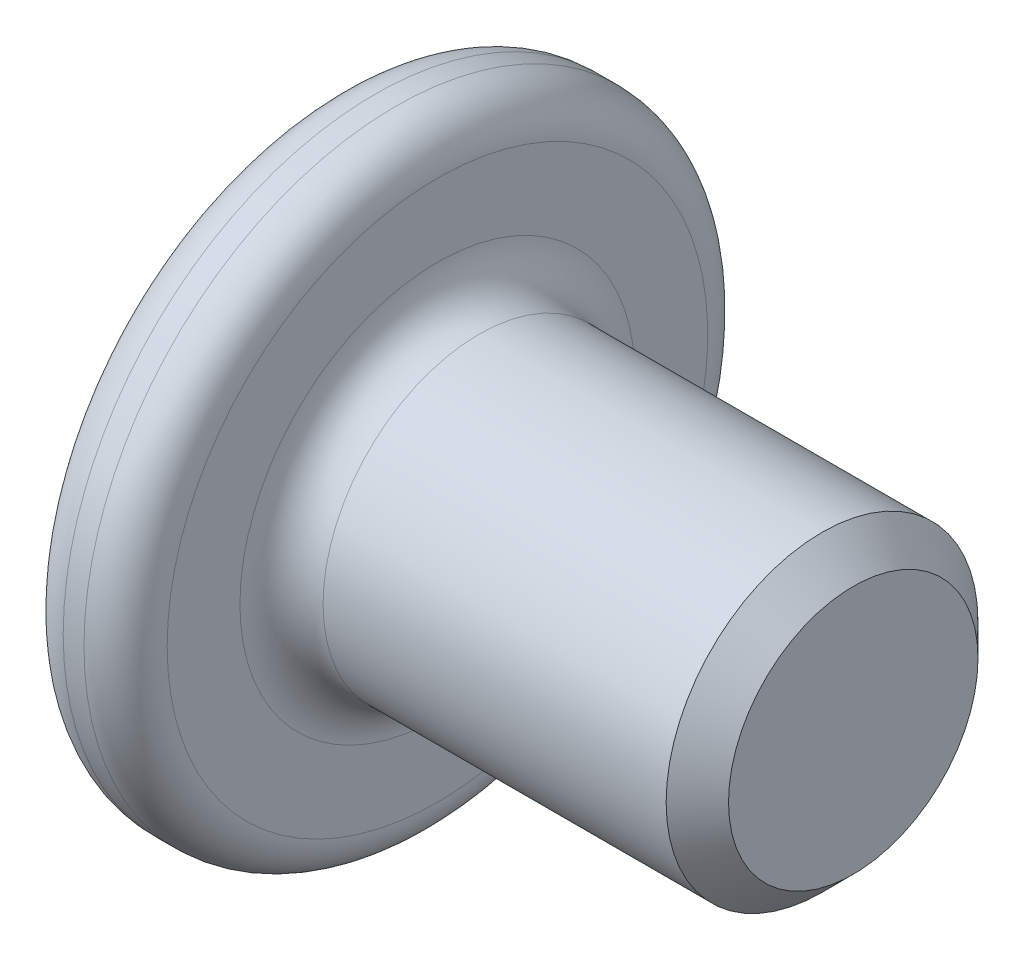
ISO-10303-21;
HEADER;
FILE_DESCRIPTION(('STEP AP214'),'2;1');
FILE_NAME('part.step','',(''),(''),'','','');
FILE_SCHEMA(('AUTOMOTIVE_DESIGN { 1 0 10303 214 1 1 1 1 }'));
ENDSEC;
DATA;
#1=APPLICATION_CONTEXT('core data for automotive mechanical design processes');
#2=APPLICATION_PROTOCOL_DEFINITION('international standard','automotive_design',2000,#1);
#3=PRODUCT_CONTEXT('',#1,'mechanical');
#4=PRODUCT('Part','Part','',(#3));
#5=PRODUCT_RELATED_PRODUCT_CATEGORY('part','',(#4));
#6=PRODUCT_DEFINITION_FORMATION('','',#4);
#7=PRODUCT_DEFINITION_CONTEXT('part definition',#1,'design');
#8=PRODUCT_DEFINITION('design','',#6,#7);
#9=PRODUCT_DEFINITION_SHAPE('','',#8);
#10=(LENGTH_UNIT() NAMED_UNIT(*) SI_UNIT(.MILLI.,.METRE.));
#11=(NAMED_UNIT(*) PLANE_ANGLE_UNIT() SI_UNIT($,.RADIAN.));
#12=(NAMED_UNIT(*) SI_UNIT($,.STERADIAN.) SOLID_ANGLE_UNIT());
#13=UNCERTAINTY_MEASURE_WITH_UNIT(LENGTH_MEASURE(1.E-05),#10,'distance_accuracy_value','');
#14=(GEOMETRIC_REPRESENTATION_CONTEXT(3) GLOBAL_UNCERTAINTY_ASSIGNED_CONTEXT((#13)) GLOBAL_UNIT_ASSIGNED_CONTEXT((#10,
#11,#12)) REPRESENTATION_CONTEXT('',''));
#15=CARTESIAN_POINT('',(0.,0.,0.));
#16=DIRECTION('',(0.,0.,1.));
#17=DIRECTION('',(1.,0.,0.));
#18=AXIS2_PLACEMENT_3D('',#15,#16,#17);
#19=CARTESIAN_POINT('',(0.,0.,0.));
#20=DIRECTION('',(1.,0.,0.));
#21=DIRECTION('',(0.,0.,-1.));
#22=AXIS2_PLACEMENT_3D('',#19,#20,#21);
#23=PLANE('',#22);
#24=DIRECTION('',(0.,0.,1.));
#25=VECTOR('',#24,1.);
#26=CARTESIAN_POINT('',(0.,-0.199999999999999,0.));
#27=LINE('',#26,#25);
#28=CARTESIAN_POINT('',(0.,-0.199999999999999,0.2));
#29=VERTEX_POINT('',#28);
#30=CARTESIAN_POINT('',(0.,-0.199999999999999,2.));
#31=VERTEX_POINT('',#30);
#32=EDGE_CURVE('E177',#29,#31,#27,.T.);
#33=ORIENTED_EDGE('',*,*,#32,.F.);
#34=DIRECTION('',(0.,1.,0.));
#35=VECTOR('',#34,1.);
#36=CARTESIAN_POINT('',(0.,0.,0.2));
#37=LINE('',#36,#35);
#38=CARTESIAN_POINT('',(0.,-2.,0.2));
#39=VERTEX_POINT('',#38);
#40=EDGE_CURVE('E62',#39,#29,#37,.T.);
#41=ORIENTED_EDGE('',*,*,#40,.F.);
#42=DIRECTION('',(0.,0.,-1.));
#43=VECTOR('',#42,1.);
#44=CARTESIAN_POINT('',(0.,-2.,0.));
#45=LINE('',#44,#43);
#46=CARTESIAN_POINT('',(0.,-2.,-0.2));
#47=VERTEX_POINT('',#46);
#48=EDGE_CURVE('E214',#39,#47,#45,.T.);
#49=ORIENTED_EDGE('',*,*,#48,.T.);
#50=DIRECTION('',(0.,1.,0.));
#51=VECTOR('',#50,1.);
#52=CARTESIAN_POINT('',(0.,0.,-0.2));
#53=LINE('',#52,#51);
#54=CARTESIAN_POINT('',(0.,-0.199999999999999,-0.2));
#55=VERTEX_POINT('',#54);
#56=EDGE_CURVE('E211',#47,#55,#53,.T.);
#57=ORIENTED_EDGE('',*,*,#56,.T.);
#58=DIRECTION('',(0.,0.,1.));
#59=VECTOR('',#58,1.);
#60=CARTESIAN_POINT('',(0.,-0.199999999999999,0.));
#61=LINE('',#60,#59);
#62=CARTESIAN_POINT('',(0.,-0.199999999999999,-2.));
#63=VERTEX_POINT('',#62);
#64=EDGE_CURVE('E156',#63,#55,#61,.T.);
#65=ORIENTED_EDGE('',*,*,#64,.F.);
#66=DIRECTION('',(0.,1.,0.));
#67=VECTOR('',#66,1.);
#68=CARTESIAN_POINT('',(0.,0.,-2.));
#69=LINE('',#68,#67);
#70=CARTESIAN_POINT('',(0.,0.200000000000001,-2.));
#71=VERTEX_POINT('',#70);
#72=EDGE_CURVE('E205',#63,#71,#69,.T.);
#73=ORIENTED_EDGE('',*,*,#72,.T.);
#74=DIRECTION('',(0.,0.,1.));
#75=VECTOR('',#74,1.);
#76=CARTESIAN_POINT('',(0.,0.200000000000001,0.));
#77=LINE('',#76,#75);
#78=CARTESIAN_POINT('',(0.,0.200000000000001,-0.2));
#79=VERTEX_POINT('',#78);
#80=EDGE_CURVE('E201',#71,#79,#77,.T.);
#81=ORIENTED_EDGE('',*,*,#80,.T.);
#82=DIRECTION('',(0.,1.,0.));
#83=VECTOR('',#82,1.);
#84=CARTESIAN_POINT('',(0.,0.,-0.2));
#85=LINE('',#84,#83);
#86=CARTESIAN_POINT('',(0.,2.,-0.2));
#87=VERTEX_POINT('',#86);
#88=EDGE_CURVE('E197',#79,#87,#85,.T.);
#89=ORIENTED_EDGE('',*,*,#88,.T.);
#90=DIRECTION('',(0.,0.,-1.));
#91=VECTOR('',#90,1.);
#92=CARTESIAN_POINT('',(0.,2.,0.));
#93=LINE('',#92,#91);
#94=CARTESIAN_POINT('',(0.,2.,0.2));
#95=VERTEX_POINT('',#94);
#96=EDGE_CURVE('E193',#95,#87,#93,.T.);
#97=ORIENTED_EDGE('',*,*,#96,.F.);
#98=DIRECTION('',(0.,1.,0.));
#99=VECTOR('',#98,1.);
#100=CARTESIAN_POINT('',(0.,0.,0.2));
#101=LINE('',#100,#99);
#102=CARTESIAN_POINT('',(0.,0.200000000000001,0.2));
#103=VERTEX_POINT('',#102);
#104=EDGE_CURVE('E189',#103,#95,#101,.T.);
#105=ORIENTED_EDGE('',*,*,#104,.F.);
#106=DIRECTION('',(0.,0.,1.));
#107=VECTOR('',#106,1.);
#108=CARTESIAN_POINT('',(0.,0.200000000000001,0.));
#109=LINE('',#108,#107);
#110=CARTESIAN_POINT('',(0.,0.200000000000001,2.));
#111=VERTEX_POINT('',#110);
#112=EDGE_CURVE('E185',#103,#111,#109,.T.);
#113=ORIENTED_EDGE('',*,*,#112,.T.);
#114=DIRECTION('',(0.,1.,0.));
#115=VECTOR('',#114,1.);
#116=CARTESIAN_POINT('',(0.,0.,2.));
#117=LINE('',#116,#115);
#118=EDGE_CURVE('E181',#31,#111,#117,.T.);
#119=ORIENTED_EDGE('',*,*,#118,.F.);
#120=EDGE_LOOP('',(#33,#41,#49,#57,#65,#73,#81,#89,#97,#105,#113,#119));
#121=FACE_BOUND('',#120,.T.);
#122=CARTESIAN_POINT('',(0.,0.,0.));
#123=DIRECTION('',(1.,0.,0.));
#124=DIRECTION('',(0.,0.,-1.));
#125=AXIS2_PLACEMENT_3D('',#122,#123,#124);
#126=CIRCLE('',#125,2.6);
#127=CARTESIAN_POINT('',(0.,0.,-2.6));
#128=VERTEX_POINT('',#127);
#129=EDGE_CURVE('E221',#128,#128,#126,.F.);
#130=ORIENTED_EDGE('',*,*,#129,.T.);
#131=EDGE_LOOP('',(#130));
#132=FACE_BOUND('',#131,.T.);
#133=ADVANCED_FACE('F45',(#121,#132),#23,.F.);
#134=CARTESIAN_POINT('',(-40.5884366755946,0.,0.));
#135=DIRECTION('',(-1.,0.,0.));
#136=DIRECTION('',(0.,0.,1.));
#137=AXIS2_PLACEMENT_3D('',#134,#135,#136);
#138=CYLINDRICAL_SURFACE('',#137,3.);
#139=CARTESIAN_POINT('',(0.399999999999998,0.,0.));
#140=DIRECTION('',(1.,0.,0.));
#141=DIRECTION('',(0.,0.,-1.));
#142=AXIS2_PLACEMENT_3D('',#139,#140,#141);
#143=CIRCLE('',#142,3.);
#144=CARTESIAN_POINT('',(0.399999999999998,0.,-3.));
#145=VERTEX_POINT('',#144);
#146=EDGE_CURVE('E256',#145,#145,#143,.T.);
#147=ORIENTED_EDGE('',*,*,#146,.T.);
#148=EDGE_LOOP('',(#147));
#149=FACE_BOUND('',#148,.T.);
#150=CARTESIAN_POINT('',(0.600000000000003,0.,0.));
#151=DIRECTION('',(-1.,0.,0.));
#152=DIRECTION('',(0.,0.,1.));
#153=AXIS2_PLACEMENT_3D('',#150,#151,#152);
#154=CIRCLE('',#153,3.);
#155=CARTESIAN_POINT('',(0.600000000000003,0.,3.));
#156=VERTEX_POINT('',#155);
#157=EDGE_CURVE('E252',#156,#156,#154,.T.);
#158=ORIENTED_EDGE('',*,*,#157,.T.);
#159=EDGE_LOOP('',(#158));
#160=FACE_BOUND('',#159,.T.);
#161=ADVANCED_FACE('F287',(#149,#160),#138,.T.);
#162=CARTESIAN_POINT('',(1.,3.,0.));
#163=DIRECTION('',(-1.,0.,0.));
#164=DIRECTION('',(0.,0.,1.));
#165=AXIS2_PLACEMENT_3D('',#162,#163,#164);
#166=PLANE('',#165);
#167=CARTESIAN_POINT('',(1.,0.,0.));
#168=DIRECTION('',(-1.,0.,0.));
#169=DIRECTION('',(0.,0.,1.));
#170=AXIS2_PLACEMENT_3D('',#167,#168,#169);
#171=CIRCLE('',#170,2.6);
#172=CARTESIAN_POINT('',(1.,0.,2.6));
#173=VERTEX_POINT('',#172);
#174=EDGE_CURVE('E264',#173,#173,#171,.F.);
#175=ORIENTED_EDGE('',*,*,#174,.T.);
#176=EDGE_LOOP('',(#175));
#177=FACE_BOUND('',#176,.T.);
#178=CARTESIAN_POINT('',(1.,0.,0.));
#179=DIRECTION('',(-1.,0.,0.));
#180=DIRECTION('',(0.,0.,1.));
#181=AXIS2_PLACEMENT_3D('',#178,#179,#180);
#182=CIRCLE('',#181,1.9);
#183=CARTESIAN_POINT('',(1.,0.,1.9));
#184=VERTEX_POINT('',#183);
#185=EDGE_CURVE('E260',#184,#184,#182,.T.);
#186=ORIENTED_EDGE('',*,*,#185,.T.);
#187=EDGE_LOOP('',(#186));
#188=FACE_BOUND('',#187,.T.);
#189=ADVANCED_FACE('F293',(#177,#188),#166,.F.);
#190=CARTESIAN_POINT('',(-40.5884366755946,0.,0.));
#191=DIRECTION('',(-1.,0.,0.));
#192=DIRECTION('',(0.,0.,1.));
#193=AXIS2_PLACEMENT_3D('',#190,#191,#192);
#194=CYLINDRICAL_SURFACE('',#193,1.5);
#195=CARTESIAN_POINT('',(4.7,0.,0.));
#196=DIRECTION('',(-1.,0.,0.));
#197=DIRECTION('',(0.,0.,1.));
#198=AXIS2_PLACEMENT_3D('',#195,#196,#197);
#199=CIRCLE('',#198,1.5);
#200=CARTESIAN_POINT('',(4.7,0.,1.5));
#201=VERTEX_POINT('',#200);
#202=EDGE_CURVE('E55',#201,#201,#199,.T.);
#203=ORIENTED_EDGE('',*,*,#202,.T.);
#204=EDGE_LOOP('',(#203));
#205=FACE_BOUND('',#204,.T.);
#206=CARTESIAN_POINT('',(1.4,0.,0.));
#207=DIRECTION('',(-1.,0.,0.));
#208=DIRECTION('',(0.,0.,1.));
#209=AXIS2_PLACEMENT_3D('',#206,#207,#208);
#210=CIRCLE('',#209,1.5);
#211=CARTESIAN_POINT('',(1.4,0.,1.5));
#212=VERTEX_POINT('',#211);
#213=EDGE_CURVE('E268',#212,#212,#210,.F.);
#214=ORIENTED_EDGE('',*,*,#213,.T.);
#215=EDGE_LOOP('',(#214));
#216=FACE_BOUND('',#215,.T.);
#217=ADVANCED_FACE('F275',(#205,#216),#194,.T.);
#218=CARTESIAN_POINT('',(5.,1.5,0.));
#219=DIRECTION('',(-1.,0.,0.));
#220=DIRECTION('',(0.,0.,1.));
#221=AXIS2_PLACEMENT_3D('',#218,#219,#220);
#222=PLANE('',#221);
#223=CARTESIAN_POINT('',(5.,0.,0.));
#224=DIRECTION('',(-1.,0.,0.));
#225=DIRECTION('',(0.,0.,1.));
#226=AXIS2_PLACEMENT_3D('',#223,#224,#225);
#227=CIRCLE('',#226,1.19999999999999);
#228=CARTESIAN_POINT('',(5.,0.,1.19999999999999));
#229=VERTEX_POINT('',#228);
#230=EDGE_CURVE('E11',#229,#229,#227,.F.);
#231=ORIENTED_EDGE('',*,*,#230,.T.);
#232=EDGE_LOOP('',(#231));
#233=FACE_BOUND('',#232,.T.);
#234=ADVANCED_FACE('F304',(#233),#222,.F.);
#235=CARTESIAN_POINT('',(0.399999999999998,0.,0.));
#236=DIRECTION('',(1.,0.,0.));
#237=DIRECTION('',(0.,0.,-1.));
#238=AXIS2_PLACEMENT_3D('',#235,#236,#237);
#239=TOROIDAL_SURFACE('',#238,2.6,0.4);
#240=ORIENTED_EDGE('',*,*,#146,.F.);
#241=EDGE_LOOP('',(#240));
#242=FACE_BOUND('',#241,.T.);
#243=ORIENTED_EDGE('',*,*,#129,.F.);
#244=EDGE_LOOP('',(#243));
#245=FACE_BOUND('',#244,.T.);
#246=ADVANCED_FACE('F300',(#242,#245),#239,.T.);
#247=CARTESIAN_POINT('',(0.600000000000003,0.,0.));
#248=DIRECTION('',(-1.,0.,0.));
#249=DIRECTION('',(0.,0.,1.));
#250=AXIS2_PLACEMENT_3D('',#247,#248,#249);
#251=TOROIDAL_SURFACE('',#250,2.6,0.4);
#252=ORIENTED_EDGE('',*,*,#174,.F.);
#253=EDGE_LOOP('',(#252));
#254=FACE_BOUND('',#253,.T.);
#255=ORIENTED_EDGE('',*,*,#157,.F.);
#256=EDGE_LOOP('',(#255));
#257=FACE_BOUND('',#256,.T.);
#258=ADVANCED_FACE('F303',(#254,#257),#251,.T.);
#259=CARTESIAN_POINT('',(1.4,0.,0.));
#260=DIRECTION('',(-1.,0.,0.));
#261=DIRECTION('',(0.,0.,1.));
#262=AXIS2_PLACEMENT_3D('',#259,#260,#261);
#263=TOROIDAL_SURFACE('',#262,1.9,0.4);
#264=ORIENTED_EDGE('',*,*,#213,.F.);
#265=EDGE_LOOP('',(#264));
#266=FACE_BOUND('',#265,.T.);
#267=ORIENTED_EDGE('',*,*,#185,.F.);
#268=EDGE_LOOP('',(#267));
#269=FACE_BOUND('',#268,.T.);
#270=ADVANCED_FACE('F307',(#266,#269),#263,.F.);
#271=CARTESIAN_POINT('',(0.5,0.,0.2));
#272=DIRECTION('',(0.,0.,1.));
#273=DIRECTION('',(0.,-1.,0.));
#274=AXIS2_PLACEMENT_3D('',#271,#272,#273);
#275=PLANE('',#274);
#276=ORIENTED_EDGE('',*,*,#40,.T.);
#277=DIRECTION('',(-1.,0.,0.));
#278=VECTOR('',#277,1.);
#279=CARTESIAN_POINT('',(0.5,-0.199999999999999,0.2));
#280=LINE('',#279,#278);
#281=CARTESIAN_POINT('',(0.5,-0.199999999999999,0.2));
#282=VERTEX_POINT('',#281);
#283=EDGE_CURVE('E110',#282,#29,#280,.T.);
#284=ORIENTED_EDGE('',*,*,#283,.F.);
#285=DIRECTION('',(0.,1.,0.));
#286=VECTOR('',#285,1.);
#287=CARTESIAN_POINT('',(0.5,0.,0.2));
#288=LINE('',#287,#286);
#289=CARTESIAN_POINT('',(0.5,-2.,0.2));
#290=VERTEX_POINT('',#289);
#291=EDGE_CURVE('E218',#290,#282,#288,.T.);
#292=ORIENTED_EDGE('',*,*,#291,.F.);
#293=DIRECTION('',(-1.,0.,0.));
#294=VECTOR('',#293,1.);
#295=CARTESIAN_POINT('',(0.5,-2.,0.2));
#296=LINE('',#295,#294);
#297=EDGE_CURVE('E70',#290,#39,#296,.T.);
#298=ORIENTED_EDGE('',*,*,#297,.T.);
#299=EDGE_LOOP('',(#276,#284,#292,#298));
#300=FACE_BOUND('',#299,.T.);
#301=ADVANCED_FACE('F310',(#300),#275,.F.);
#302=CARTESIAN_POINT('',(0.5,-2.,0.));
#303=DIRECTION('',(0.,1.,0.));
#304=DIRECTION('',(0.,0.,1.));
#305=AXIS2_PLACEMENT_3D('',#302,#303,#304);
#306=PLANE('',#305);
#307=ORIENTED_EDGE('',*,*,#48,.F.);
#308=ORIENTED_EDGE('',*,*,#297,.F.);
#309=DIRECTION('',(0.,0.,-1.));
#310=VECTOR('',#309,1.);
#311=CARTESIAN_POINT('',(0.5,-2.,0.));
#312=LINE('',#311,#310);
#313=CARTESIAN_POINT('',(0.5,-2.,-0.2));
#314=VERTEX_POINT('',#313);
#315=EDGE_CURVE('E149',#290,#314,#312,.T.);
#316=ORIENTED_EDGE('',*,*,#315,.T.);
#317=DIRECTION('',(-1.,0.,0.));
#318=VECTOR('',#317,1.);
#319=CARTESIAN_POINT('',(0.5,-2.,-0.2));
#320=LINE('',#319,#318);
#321=EDGE_CURVE('E145',#314,#47,#320,.T.);
#322=ORIENTED_EDGE('',*,*,#321,.T.);
#323=EDGE_LOOP('',(#307,#308,#316,#322));
#324=FACE_BOUND('',#323,.T.);
#325=ADVANCED_FACE('F315',(#324),#306,.T.);
#326=CARTESIAN_POINT('',(0.5,0.,-0.2));
#327=DIRECTION('',(0.,0.,1.));
#328=DIRECTION('',(0.,-1.,0.));
#329=AXIS2_PLACEMENT_3D('',#326,#327,#328);
#330=PLANE('',#329);
#331=ORIENTED_EDGE('',*,*,#56,.F.);
#332=ORIENTED_EDGE('',*,*,#321,.F.);
#333=DIRECTION('',(0.,1.,0.));
#334=VECTOR('',#333,1.);
#335=CARTESIAN_POINT('',(0.5,0.,-0.2));
#336=LINE('',#335,#334);
#337=CARTESIAN_POINT('',(0.5,-0.199999999999999,-0.2));
#338=VERTEX_POINT('',#337);
#339=EDGE_CURVE('E139',#314,#338,#336,.T.);
#340=ORIENTED_EDGE('',*,*,#339,.T.);
#341=DIRECTION('',(-1.,0.,0.));
#342=VECTOR('',#341,1.);
#343=CARTESIAN_POINT('',(0.5,-0.199999999999999,-0.2));
#344=LINE('',#343,#342);
#345=EDGE_CURVE('E143',#338,#55,#344,.T.);
#346=ORIENTED_EDGE('',*,*,#345,.T.);
#347=EDGE_LOOP('',(#331,#332,#340,#346));
#348=FACE_BOUND('',#347,.T.);
#349=ADVANCED_FACE('F142',(#348),#330,.T.);
#350=CARTESIAN_POINT('',(0.5,-0.199999999999999,0.));
#351=DIRECTION('',(0.,-1.,0.));
#352=DIRECTION('',(0.,0.,-1.));
#353=AXIS2_PLACEMENT_3D('',#350,#351,#352);
#354=PLANE('',#353);
#355=ORIENTED_EDGE('',*,*,#64,.T.);
#356=ORIENTED_EDGE('',*,*,#345,.F.);
#357=DIRECTION('',(0.,0.,1.));
#358=VECTOR('',#357,1.);
#359=CARTESIAN_POINT('',(0.5,-0.199999999999999,0.));
#360=LINE('',#359,#358);
#361=CARTESIAN_POINT('',(0.5,-0.199999999999999,-2.));
#362=VERTEX_POINT('',#361);
#363=EDGE_CURVE('E150',#362,#338,#360,.T.);
#364=ORIENTED_EDGE('',*,*,#363,.F.);
#365=DIRECTION('',(-1.,0.,0.));
#366=VECTOR('',#365,1.);
#367=CARTESIAN_POINT('',(0.5,-0.199999999999999,-2.));
#368=LINE('',#367,#366);
#369=EDGE_CURVE('E159',#362,#63,#368,.T.);
#370=ORIENTED_EDGE('',*,*,#369,.T.);
#371=EDGE_LOOP('',(#355,#356,#364,#370));
#372=FACE_BOUND('',#371,.T.);
#373=ADVANCED_FACE('F154',(#372),#354,.F.);
#374=CARTESIAN_POINT('',(0.5,0.,-2.));
#375=DIRECTION('',(0.,0.,1.));
#376=DIRECTION('',(1.,0.,0.));
#377=AXIS2_PLACEMENT_3D('',#374,#375,#376);
#378=PLANE('',#377);
#379=ORIENTED_EDGE('',*,*,#72,.F.);
#380=ORIENTED_EDGE('',*,*,#369,.F.);
#381=DIRECTION('',(0.,1.,0.));
#382=VECTOR('',#381,1.);
#383=CARTESIAN_POINT('',(0.5,0.,-2.));
#384=LINE('',#383,#382);
#385=CARTESIAN_POINT('',(0.5,0.200000000000001,-2.));
#386=VERTEX_POINT('',#385);
#387=EDGE_CURVE('E165',#362,#386,#384,.T.);
#388=ORIENTED_EDGE('',*,*,#387,.T.);
#389=DIRECTION('',(-1.,0.,0.));
#390=VECTOR('',#389,1.);
#391=CARTESIAN_POINT('',(0.5,0.200000000000001,-2.));
#392=LINE('',#391,#390);
#393=EDGE_CURVE('E226',#386,#71,#392,.T.);
#394=ORIENTED_EDGE('',*,*,#393,.T.);
#395=EDGE_LOOP('',(#379,#380,#388,#394));
#396=FACE_BOUND('',#395,.T.);
#397=ADVANCED_FACE('F357',(#396),#378,.T.);
#398=CARTESIAN_POINT('',(0.5,0.200000000000001,0.));
#399=DIRECTION('',(0.,-1.,0.));
#400=DIRECTION('',(0.,0.,-1.));
#401=AXIS2_PLACEMENT_3D('',#398,#399,#400);
#402=PLANE('',#401);
#403=ORIENTED_EDGE('',*,*,#80,.F.);
#404=ORIENTED_EDGE('',*,*,#393,.F.);
#405=DIRECTION('',(0.,0.,1.));
#406=VECTOR('',#405,1.);
#407=CARTESIAN_POINT('',(0.5,0.200000000000001,0.));
#408=LINE('',#407,#406);
#409=CARTESIAN_POINT('',(0.5,0.200000000000001,-0.2));
#410=VERTEX_POINT('',#409);
#411=EDGE_CURVE('E169',#386,#410,#408,.T.);
#412=ORIENTED_EDGE('',*,*,#411,.T.);
#413=DIRECTION('',(-1.,0.,0.));
#414=VECTOR('',#413,1.);
#415=CARTESIAN_POINT('',(0.5,0.200000000000001,-0.2));
#416=LINE('',#415,#414);
#417=EDGE_CURVE('E229',#410,#79,#416,.T.);
#418=ORIENTED_EDGE('',*,*,#417,.T.);
#419=EDGE_LOOP('',(#403,#404,#412,#418));
#420=FACE_BOUND('',#419,.T.);
#421=ADVANCED_FACE('F353',(#420),#402,.T.);
#422=CARTESIAN_POINT('',(0.5,0.,-0.2));
#423=DIRECTION('',(0.,0.,1.));
#424=DIRECTION('',(0.,-1.,0.));
#425=AXIS2_PLACEMENT_3D('',#422,#423,#424);
#426=PLANE('',#425);
#427=ORIENTED_EDGE('',*,*,#88,.F.);
#428=ORIENTED_EDGE('',*,*,#417,.F.);
#429=DIRECTION('',(0.,1.,0.));
#430=VECTOR('',#429,1.);
#431=CARTESIAN_POINT('',(0.5,0.,-0.2));
#432=LINE('',#431,#430);
#433=CARTESIAN_POINT('',(0.5,2.,-0.2));
#434=VERTEX_POINT('',#433);
#435=EDGE_CURVE('E393',#410,#434,#432,.T.);
#436=ORIENTED_EDGE('',*,*,#435,.T.);
#437=DIRECTION('',(-1.,0.,0.));
#438=VECTOR('',#437,1.);
#439=CARTESIAN_POINT('',(0.5,2.,-0.2));
#440=LINE('',#439,#438);
#441=EDGE_CURVE('E232',#434,#87,#440,.T.);
#442=ORIENTED_EDGE('',*,*,#441,.T.);
#443=EDGE_LOOP('',(#427,#428,#436,#442));
#444=FACE_BOUND('',#443,.T.);
#445=ADVANCED_FACE('F349',(#444),#426,.T.);
#446=CARTESIAN_POINT('',(0.5,2.,0.));
#447=DIRECTION('',(0.,1.,0.));
#448=DIRECTION('',(0.,0.,1.));
#449=AXIS2_PLACEMENT_3D('',#446,#447,#448);
#450=PLANE('',#449);
#451=ORIENTED_EDGE('',*,*,#96,.T.);
#452=ORIENTED_EDGE('',*,*,#441,.F.);
#453=DIRECTION('',(0.,0.,-1.));
#454=VECTOR('',#453,1.);
#455=CARTESIAN_POINT('',(0.5,2.,0.));
#456=LINE('',#455,#454);
#457=CARTESIAN_POINT('',(0.5,2.,0.2));
#458=VERTEX_POINT('',#457);
#459=EDGE_CURVE('E389',#458,#434,#456,.T.);
#460=ORIENTED_EDGE('',*,*,#459,.F.);
#461=DIRECTION('',(-1.,0.,0.));
#462=VECTOR('',#461,1.);
#463=CARTESIAN_POINT('',(0.5,2.,0.2));
#464=LINE('',#463,#462);
#465=EDGE_CURVE('E235',#458,#95,#464,.T.);
#466=ORIENTED_EDGE('',*,*,#465,.T.);
#467=EDGE_LOOP('',(#451,#452,#460,#466));
#468=FACE_BOUND('',#467,.T.);
#469=ADVANCED_FACE('F345',(#468),#450,.F.);
#470=CARTESIAN_POINT('',(0.5,0.,0.2));
#471=DIRECTION('',(0.,0.,1.));
#472=DIRECTION('',(0.,-1.,0.));
#473=AXIS2_PLACEMENT_3D('',#470,#471,#472);
#474=PLANE('',#473);
#475=ORIENTED_EDGE('',*,*,#104,.T.);
#476=ORIENTED_EDGE('',*,*,#465,.F.);
#477=DIRECTION('',(0.,1.,0.));
#478=VECTOR('',#477,1.);
#479=CARTESIAN_POINT('',(0.5,0.,0.2));
#480=LINE('',#479,#478);
#481=CARTESIAN_POINT('',(0.5,0.200000000000001,0.2));
#482=VERTEX_POINT('',#481);
#483=EDGE_CURVE('E385',#482,#458,#480,.T.);
#484=ORIENTED_EDGE('',*,*,#483,.F.);
#485=DIRECTION('',(-1.,0.,0.));
#486=VECTOR('',#485,1.);
#487=CARTESIAN_POINT('',(0.5,0.200000000000001,0.2));
#488=LINE('',#487,#486);
#489=EDGE_CURVE('E238',#482,#103,#488,.T.);
#490=ORIENTED_EDGE('',*,*,#489,.T.);
#491=EDGE_LOOP('',(#475,#476,#484,#490));
#492=FACE_BOUND('',#491,.T.);
#493=ADVANCED_FACE('F341',(#492),#474,.F.);
#494=CARTESIAN_POINT('',(0.5,0.200000000000001,0.));
#495=DIRECTION('',(0.,-1.,0.));
#496=DIRECTION('',(0.,0.,-1.));
#497=AXIS2_PLACEMENT_3D('',#494,#495,#496);
#498=PLANE('',#497);
#499=ORIENTED_EDGE('',*,*,#112,.F.);
#500=ORIENTED_EDGE('',*,*,#489,.F.);
#501=DIRECTION('',(0.,0.,1.));
#502=VECTOR('',#501,1.);
#503=CARTESIAN_POINT('',(0.5,0.200000000000001,0.));
#504=LINE('',#503,#502);
#505=CARTESIAN_POINT('',(0.5,0.200000000000001,2.));
#506=VERTEX_POINT('',#505);
#507=EDGE_CURVE('E382',#482,#506,#504,.T.);
#508=ORIENTED_EDGE('',*,*,#507,.T.);
#509=DIRECTION('',(-1.,0.,0.));
#510=VECTOR('',#509,1.);
#511=CARTESIAN_POINT('',(0.5,0.200000000000001,2.));
#512=LINE('',#511,#510);
#513=EDGE_CURVE('E241',#506,#111,#512,.T.);
#514=ORIENTED_EDGE('',*,*,#513,.T.);
#515=EDGE_LOOP('',(#499,#500,#508,#514));
#516=FACE_BOUND('',#515,.T.);
#517=ADVANCED_FACE('F337',(#516),#498,.T.);
#518=CARTESIAN_POINT('',(0.5,0.,2.));
#519=DIRECTION('',(0.,0.,1.));
#520=DIRECTION('',(1.,0.,0.));
#521=AXIS2_PLACEMENT_3D('',#518,#519,#520);
#522=PLANE('',#521);
#523=ORIENTED_EDGE('',*,*,#118,.T.);
#524=ORIENTED_EDGE('',*,*,#513,.F.);
#525=DIRECTION('',(0.,1.,0.));
#526=VECTOR('',#525,1.);
#527=CARTESIAN_POINT('',(0.5,0.,2.));
#528=LINE('',#527,#526);
#529=CARTESIAN_POINT('',(0.5,-0.199999999999999,2.));
#530=VERTEX_POINT('',#529);
#531=EDGE_CURVE('E375',#530,#506,#528,.T.);
#532=ORIENTED_EDGE('',*,*,#531,.F.);
#533=DIRECTION('',(-1.,0.,0.));
#534=VECTOR('',#533,1.);
#535=CARTESIAN_POINT('',(0.5,-0.199999999999999,2.));
#536=LINE('',#535,#534);
#537=EDGE_CURVE('E244',#530,#31,#536,.T.);
#538=ORIENTED_EDGE('',*,*,#537,.T.);
#539=EDGE_LOOP('',(#523,#524,#532,#538));
#540=FACE_BOUND('',#539,.T.);
#541=ADVANCED_FACE('F333',(#540),#522,.F.);
#542=CARTESIAN_POINT('',(0.5,-0.199999999999999,0.));
#543=DIRECTION('',(0.,-1.,0.));
#544=DIRECTION('',(0.,0.,-1.));
#545=AXIS2_PLACEMENT_3D('',#542,#543,#544);
#546=PLANE('',#545);
#547=ORIENTED_EDGE('',*,*,#32,.T.);
#548=ORIENTED_EDGE('',*,*,#537,.F.);
#549=DIRECTION('',(0.,0.,1.));
#550=VECTOR('',#549,1.);
#551=CARTESIAN_POINT('',(0.5,-0.199999999999999,0.));
#552=LINE('',#551,#550);
#553=EDGE_CURVE('E372',#282,#530,#552,.T.);
#554=ORIENTED_EDGE('',*,*,#553,.F.);
#555=ORIENTED_EDGE('',*,*,#283,.T.);
#556=EDGE_LOOP('',(#547,#548,#554,#555));
#557=FACE_BOUND('',#556,.T.);
#558=ADVANCED_FACE('F283',(#557),#546,.F.);
#559=CARTESIAN_POINT('',(0.5,0.,0.));
#560=DIRECTION('',(-1.,0.,0.));
#561=DIRECTION('',(0.,0.,1.));
#562=AXIS2_PLACEMENT_3D('',#559,#560,#561);
#563=PLANE('',#562);
#564=ORIENTED_EDGE('',*,*,#291,.T.);
#565=ORIENTED_EDGE('',*,*,#553,.T.);
#566=ORIENTED_EDGE('',*,*,#531,.T.);
#567=ORIENTED_EDGE('',*,*,#507,.F.);
#568=ORIENTED_EDGE('',*,*,#483,.T.);
#569=ORIENTED_EDGE('',*,*,#459,.T.);
#570=ORIENTED_EDGE('',*,*,#435,.F.);
#571=ORIENTED_EDGE('',*,*,#411,.F.);
#572=ORIENTED_EDGE('',*,*,#387,.F.);
#573=ORIENTED_EDGE('',*,*,#363,.T.);
#574=ORIENTED_EDGE('',*,*,#339,.F.);
#575=ORIENTED_EDGE('',*,*,#315,.F.);
#576=EDGE_LOOP('',(#564,#565,#566,#567,#568,#569,#570,#571,#572,#573,#574,#575));
#577=FACE_BOUND('',#576,.T.);
#578=ADVANCED_FACE('F163',(#577),#563,.T.);
#579=CARTESIAN_POINT('',(4.7,0.,0.));
#580=DIRECTION('',(-1.,0.,0.));
#581=DIRECTION('',(0.,0.,1.));
#582=AXIS2_PLACEMENT_3D('',#579,#580,#581);
#583=CONICAL_SURFACE('',#582,1.5,0.785398163397456);
#584=ORIENTED_EDGE('',*,*,#230,.F.);
#585=EDGE_LOOP('',(#584));
#586=FACE_BOUND('',#585,.T.);
#587=ORIENTED_EDGE('',*,*,#202,.F.);
#588=EDGE_LOOP('',(#587));
#589=FACE_BOUND('',#588,.T.);
#590=ADVANCED_FACE('F48',(#586,#589),#583,.T.);
#591=CLOSED_SHELL('',(#133,#161,#189,#217,#234,#246,#258,#270,#301,#325,#349,#373,#397,#421,
#445,#469,#493,#517,#541,#558,#578,#590));
#592=MANIFOLD_SOLID_BREP('B2',#591);
#593=ADVANCED_BREP_SHAPE_REPRESENTATION('',(#18,#592),#14);
#594=SHAPE_DEFINITION_REPRESENTATION(#9,#593);
ENDSEC;
END-ISO-10303-21;
